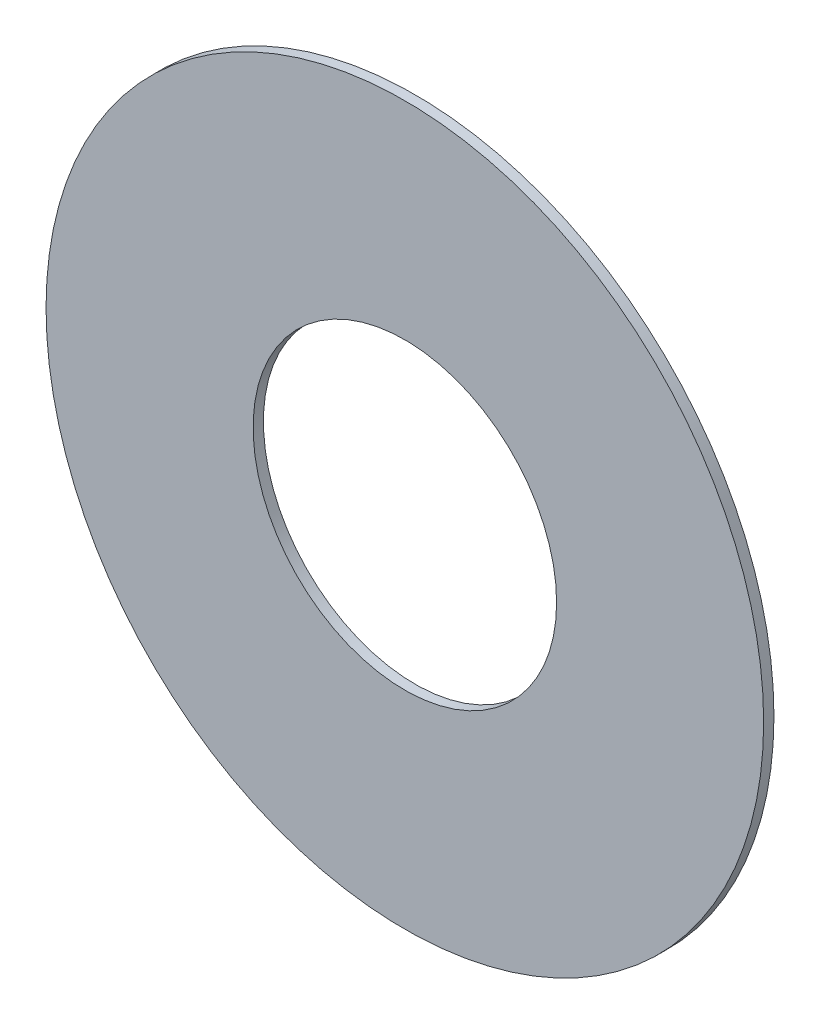
ISO-10303-21;
HEADER;
FILE_DESCRIPTION(('STEP AP214'),'2;1');
FILE_NAME('part.step','',(''),(''),'','','');
FILE_SCHEMA(('AUTOMOTIVE_DESIGN { 1 0 10303 214 1 1 1 1 }'));
ENDSEC;
DATA;
#1=APPLICATION_CONTEXT('core data for automotive mechanical design processes');
#2=APPLICATION_PROTOCOL_DEFINITION('international standard','automotive_design',2000,#1);
#3=PRODUCT_CONTEXT('',#1,'mechanical');
#4=PRODUCT('Part','Part','',(#3));
#5=PRODUCT_RELATED_PRODUCT_CATEGORY('part','',(#4));
#6=PRODUCT_DEFINITION_FORMATION('','',#4);
#7=PRODUCT_DEFINITION_CONTEXT('part definition',#1,'design');
#8=PRODUCT_DEFINITION('design','',#6,#7);
#9=PRODUCT_DEFINITION_SHAPE('','',#8);
#10=(LENGTH_UNIT() NAMED_UNIT(*) SI_UNIT(.MILLI.,.METRE.));
#11=(NAMED_UNIT(*) PLANE_ANGLE_UNIT() SI_UNIT($,.RADIAN.));
#12=(NAMED_UNIT(*) SI_UNIT($,.STERADIAN.) SOLID_ANGLE_UNIT());
#13=UNCERTAINTY_MEASURE_WITH_UNIT(LENGTH_MEASURE(1.E-05),#10,'distance_accuracy_value','');
#14=(GEOMETRIC_REPRESENTATION_CONTEXT(3) GLOBAL_UNCERTAINTY_ASSIGNED_CONTEXT((#13)) GLOBAL_UNIT_ASSIGNED_CONTEXT((#10,
#11,#12)) REPRESENTATION_CONTEXT('',''));
#15=CARTESIAN_POINT('',(0.,0.,0.));
#16=DIRECTION('',(0.,0.,1.));
#17=DIRECTION('',(1.,0.,0.));
#18=AXIS2_PLACEMENT_3D('',#15,#16,#17);
#19=CARTESIAN_POINT('',(0.,0.,-40.5));
#20=DIRECTION('',(0.,0.,1.));
#21=DIRECTION('',(1.,0.,0.));
#22=AXIS2_PLACEMENT_3D('',#19,#20,#21);
#23=PLANE('',#22);
#24=CARTESIAN_POINT('',(0.,0.,-40.5));
#25=DIRECTION('',(0.,0.,1.));
#26=DIRECTION('',(1.,0.,0.));
#27=AXIS2_PLACEMENT_3D('',#24,#25,#26);
#28=CIRCLE('',#27,69.7538461538462);
#29=CARTESIAN_POINT('',(69.7538461538462,0.,-40.5));
#30=VERTEX_POINT('',#29);
#31=EDGE_CURVE('E10',#30,#30,#28,.T.);
#32=ORIENTED_EDGE('',*,*,#31,.T.);
#33=EDGE_LOOP('',(#32));
#34=FACE_BOUND('',#33,.T.);
#35=CARTESIAN_POINT('',(0.,0.,-40.5));
#36=DIRECTION('',(0.,0.,1.));
#37=DIRECTION('',(1.,0.,0.));
#38=AXIS2_PLACEMENT_3D('',#35,#36,#37);
#39=CIRCLE('',#38,29.5);
#40=CARTESIAN_POINT('',(29.5,0.,-40.5));
#41=VERTEX_POINT('',#40);
#42=EDGE_CURVE('E46',#41,#41,#39,.T.);
#43=ORIENTED_EDGE('',*,*,#42,.F.);
#44=EDGE_LOOP('',(#43));
#45=FACE_BOUND('',#44,.T.);
#46=ADVANCED_FACE('F35',(#34,#45),#23,.T.);
#47=CARTESIAN_POINT('',(0.,0.,-42.5));
#48=DIRECTION('',(0.,0.,1.));
#49=DIRECTION('',(1.,0.,0.));
#50=AXIS2_PLACEMENT_3D('',#47,#48,#49);
#51=PLANE('',#50);
#52=CARTESIAN_POINT('',(0.,0.,-42.5));
#53=DIRECTION('',(0.,0.,1.));
#54=DIRECTION('',(1.,0.,0.));
#55=AXIS2_PLACEMENT_3D('',#52,#53,#54);
#56=CIRCLE('',#55,69.7538461538462);
#57=CARTESIAN_POINT('',(69.7538461538462,0.,-42.5));
#58=VERTEX_POINT('',#57);
#59=EDGE_CURVE('E39',#58,#58,#56,.T.);
#60=ORIENTED_EDGE('',*,*,#59,.F.);
#61=EDGE_LOOP('',(#60));
#62=FACE_BOUND('',#61,.T.);
#63=CARTESIAN_POINT('',(0.,0.,-42.5));
#64=DIRECTION('',(0.,0.,1.));
#65=DIRECTION('',(1.,0.,0.));
#66=AXIS2_PLACEMENT_3D('',#63,#64,#65);
#67=CIRCLE('',#66,29.5);
#68=CARTESIAN_POINT('',(29.5,0.,-42.5));
#69=VERTEX_POINT('',#68);
#70=EDGE_CURVE('E48',#69,#69,#67,.T.);
#71=ORIENTED_EDGE('',*,*,#70,.T.);
#72=EDGE_LOOP('',(#71));
#73=FACE_BOUND('',#72,.T.);
#74=ADVANCED_FACE('F58',(#62,#73),#51,.F.);
#75=CARTESIAN_POINT('',(0.,0.,-40.5));
#76=DIRECTION('',(0.,0.,-1.));
#77=DIRECTION('',(-1.,0.,0.));
#78=AXIS2_PLACEMENT_3D('',#75,#76,#77);
#79=CYLINDRICAL_SURFACE('',#78,69.7538461538462);
#80=ORIENTED_EDGE('',*,*,#31,.F.);
#81=EDGE_LOOP('',(#80));
#82=FACE_BOUND('',#81,.T.);
#83=ORIENTED_EDGE('',*,*,#59,.T.);
#84=EDGE_LOOP('',(#83));
#85=FACE_BOUND('',#84,.T.);
#86=ADVANCED_FACE('F37',(#82,#85),#79,.T.);
#87=CARTESIAN_POINT('',(0.,0.,-40.5));
#88=DIRECTION('',(0.,0.,-1.));
#89=DIRECTION('',(-1.,0.,0.));
#90=AXIS2_PLACEMENT_3D('',#87,#88,#89);
#91=CYLINDRICAL_SURFACE('',#90,29.5);
#92=ORIENTED_EDGE('',*,*,#42,.T.);
#93=EDGE_LOOP('',(#92));
#94=FACE_BOUND('',#93,.T.);
#95=ORIENTED_EDGE('',*,*,#70,.F.);
#96=EDGE_LOOP('',(#95));
#97=FACE_BOUND('',#96,.T.);
#98=ADVANCED_FACE('F54',(#94,#97),#91,.F.);
#99=CLOSED_SHELL('',(#46,#74,#86,#98));
#100=MANIFOLD_SOLID_BREP('B2',#99);
#101=ADVANCED_BREP_SHAPE_REPRESENTATION('',(#18,#100),#14);
#102=SHAPE_DEFINITION_REPRESENTATION(#9,#101);
ENDSEC;
END-ISO-10303-21;
